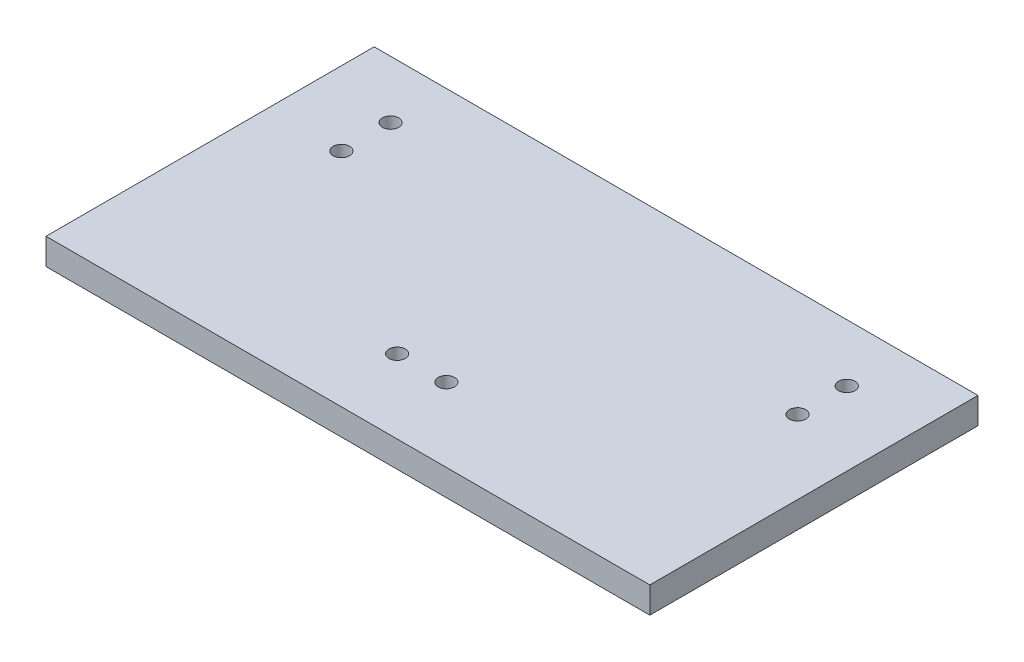
ISO-10303-21;
HEADER;
FILE_DESCRIPTION(('STEP AP214'),'2;1');
FILE_NAME('part.step','',(''),(''),'','','');
FILE_SCHEMA(('AUTOMOTIVE_DESIGN { 1 0 10303 214 1 1 1 1 }'));
ENDSEC;
DATA;
#1=APPLICATION_CONTEXT('core data for automotive mechanical design processes');
#2=APPLICATION_PROTOCOL_DEFINITION('international standard','automotive_design',2000,#1);
#3=PRODUCT_CONTEXT('',#1,'mechanical');
#4=PRODUCT('Part','Part','',(#3));
#5=PRODUCT_RELATED_PRODUCT_CATEGORY('part','',(#4));
#6=PRODUCT_DEFINITION_FORMATION('','',#4);
#7=PRODUCT_DEFINITION_CONTEXT('part definition',#1,'design');
#8=PRODUCT_DEFINITION('design','',#6,#7);
#9=PRODUCT_DEFINITION_SHAPE('','',#8);
#10=(LENGTH_UNIT() NAMED_UNIT(*) SI_UNIT(.MILLI.,.METRE.));
#11=(NAMED_UNIT(*) PLANE_ANGLE_UNIT() SI_UNIT($,.RADIAN.));
#12=(NAMED_UNIT(*) SI_UNIT($,.STERADIAN.) SOLID_ANGLE_UNIT());
#13=UNCERTAINTY_MEASURE_WITH_UNIT(LENGTH_MEASURE(1.E-05),#10,'distance_accuracy_value','');
#14=(GEOMETRIC_REPRESENTATION_CONTEXT(3) GLOBAL_UNCERTAINTY_ASSIGNED_CONTEXT((#13)) GLOBAL_UNIT_ASSIGNED_CONTEXT((#10,
#11,#12)) REPRESENTATION_CONTEXT('',''));
#15=CARTESIAN_POINT('',(0.,0.,0.));
#16=DIRECTION('',(0.,0.,1.));
#17=DIRECTION('',(1.,0.,0.));
#18=AXIS2_PLACEMENT_3D('',#15,#16,#17);
#19=CARTESIAN_POINT('',(-92.,8.,-50.));
#20=DIRECTION('',(1.,0.,0.));
#21=DIRECTION('',(0.,0.,-1.));
#22=AXIS2_PLACEMENT_3D('',#19,#20,#21);
#23=PLANE('',#22);
#24=DIRECTION('',(0.,0.,1.));
#25=VECTOR('',#24,1.);
#26=CARTESIAN_POINT('',(-92.,0.,-50.));
#27=LINE('',#26,#25);
#28=CARTESIAN_POINT('',(-92.,0.,-50.));
#29=VERTEX_POINT('',#28);
#30=CARTESIAN_POINT('',(-92.,0.,50.));
#31=VERTEX_POINT('',#30);
#32=EDGE_CURVE('E99',#29,#31,#27,.T.);
#33=ORIENTED_EDGE('',*,*,#32,.T.);
#34=DIRECTION('',(0.,-1.,0.));
#35=VECTOR('',#34,1.);
#36=CARTESIAN_POINT('',(-92.,8.,50.));
#37=LINE('',#36,#35);
#38=CARTESIAN_POINT('',(-92.,8.,50.));
#39=VERTEX_POINT('',#38);
#40=EDGE_CURVE('E11',#39,#31,#37,.T.);
#41=ORIENTED_EDGE('',*,*,#40,.F.);
#42=DIRECTION('',(0.,0.,1.));
#43=VECTOR('',#42,1.);
#44=CARTESIAN_POINT('',(-92.,8.,-50.));
#45=LINE('',#44,#43);
#46=CARTESIAN_POINT('',(-92.,8.,-50.));
#47=VERTEX_POINT('',#46);
#48=EDGE_CURVE('E87',#47,#39,#45,.T.);
#49=ORIENTED_EDGE('',*,*,#48,.F.);
#50=DIRECTION('',(0.,-1.,0.));
#51=VECTOR('',#50,1.);
#52=CARTESIAN_POINT('',(-92.,8.,-50.));
#53=LINE('',#52,#51);
#54=EDGE_CURVE('E95',#47,#29,#53,.T.);
#55=ORIENTED_EDGE('',*,*,#54,.T.);
#56=EDGE_LOOP('',(#33,#41,#49,#55));
#57=FACE_BOUND('',#56,.T.);
#58=ADVANCED_FACE('F36',(#57),#23,.F.);
#59=CARTESIAN_POINT('',(92.,8.,50.));
#60=DIRECTION('',(0.,0.,-1.));
#61=DIRECTION('',(-1.,0.,0.));
#62=AXIS2_PLACEMENT_3D('',#59,#60,#61);
#63=PLANE('',#62);
#64=DIRECTION('',(1.,0.,0.));
#65=VECTOR('',#64,1.);
#66=CARTESIAN_POINT('',(92.,0.,50.));
#67=LINE('',#66,#65);
#68=CARTESIAN_POINT('',(92.,0.,50.));
#69=VERTEX_POINT('',#68);
#70=EDGE_CURVE('E91',#31,#69,#67,.T.);
#71=ORIENTED_EDGE('',*,*,#70,.T.);
#72=DIRECTION('',(0.,-1.,0.));
#73=VECTOR('',#72,1.);
#74=CARTESIAN_POINT('',(92.,8.,50.));
#75=LINE('',#74,#73);
#76=CARTESIAN_POINT('',(92.,8.,50.));
#77=VERTEX_POINT('',#76);
#78=EDGE_CURVE('E44',#77,#69,#75,.T.);
#79=ORIENTED_EDGE('',*,*,#78,.F.);
#80=DIRECTION('',(1.,0.,0.));
#81=VECTOR('',#80,1.);
#82=CARTESIAN_POINT('',(92.,8.,50.));
#83=LINE('',#82,#81);
#84=EDGE_CURVE('E82',#39,#77,#83,.T.);
#85=ORIENTED_EDGE('',*,*,#84,.F.);
#86=ORIENTED_EDGE('',*,*,#40,.T.);
#87=EDGE_LOOP('',(#71,#79,#85,#86));
#88=FACE_BOUND('',#87,.T.);
#89=ADVANCED_FACE('F90',(#88),#63,.F.);
#90=CARTESIAN_POINT('',(92.,8.,-50.));
#91=DIRECTION('',(-1.,0.,0.));
#92=DIRECTION('',(0.,0.,1.));
#93=AXIS2_PLACEMENT_3D('',#90,#91,#92);
#94=PLANE('',#93);
#95=DIRECTION('',(0.,0.,-1.));
#96=VECTOR('',#95,1.);
#97=CARTESIAN_POINT('',(92.,0.,-50.));
#98=LINE('',#97,#96);
#99=CARTESIAN_POINT('',(92.,0.,-50.));
#100=VERTEX_POINT('',#99);
#101=EDGE_CURVE('E69',#69,#100,#98,.T.);
#102=ORIENTED_EDGE('',*,*,#101,.T.);
#103=DIRECTION('',(0.,-1.,0.));
#104=VECTOR('',#103,1.);
#105=CARTESIAN_POINT('',(92.,8.,-50.));
#106=LINE('',#105,#104);
#107=CARTESIAN_POINT('',(92.,8.,-50.));
#108=VERTEX_POINT('',#107);
#109=EDGE_CURVE('E92',#108,#100,#106,.T.);
#110=ORIENTED_EDGE('',*,*,#109,.F.);
#111=DIRECTION('',(0.,0.,-1.));
#112=VECTOR('',#111,1.);
#113=CARTESIAN_POINT('',(92.,8.,-50.));
#114=LINE('',#113,#112);
#115=EDGE_CURVE('E85',#77,#108,#114,.T.);
#116=ORIENTED_EDGE('',*,*,#115,.F.);
#117=ORIENTED_EDGE('',*,*,#78,.T.);
#118=EDGE_LOOP('',(#102,#110,#116,#117));
#119=FACE_BOUND('',#118,.T.);
#120=ADVANCED_FACE('F93',(#119),#94,.F.);
#121=CARTESIAN_POINT('',(92.,8.,-50.));
#122=DIRECTION('',(0.,0.,1.));
#123=DIRECTION('',(1.,0.,0.));
#124=AXIS2_PLACEMENT_3D('',#121,#122,#123);
#125=PLANE('',#124);
#126=DIRECTION('',(-1.,0.,0.));
#127=VECTOR('',#126,1.);
#128=CARTESIAN_POINT('',(92.,0.,-50.));
#129=LINE('',#128,#127);
#130=EDGE_CURVE('E75',#100,#29,#129,.T.);
#131=ORIENTED_EDGE('',*,*,#130,.T.);
#132=ORIENTED_EDGE('',*,*,#54,.F.);
#133=DIRECTION('',(-1.,0.,0.));
#134=VECTOR('',#133,1.);
#135=CARTESIAN_POINT('',(92.,8.,-50.));
#136=LINE('',#135,#134);
#137=EDGE_CURVE('E52',#108,#47,#136,.T.);
#138=ORIENTED_EDGE('',*,*,#137,.F.);
#139=ORIENTED_EDGE('',*,*,#109,.T.);
#140=EDGE_LOOP('',(#131,#132,#138,#139));
#141=FACE_BOUND('',#140,.T.);
#142=ADVANCED_FACE('F107',(#141),#125,.F.);
#143=CARTESIAN_POINT('',(0.,8.,0.));
#144=DIRECTION('',(0.,-1.,0.));
#145=DIRECTION('',(0.,0.,-1.));
#146=AXIS2_PLACEMENT_3D('',#143,#144,#145);
#147=PLANE('',#146);
#148=CARTESIAN_POINT('',(-69.5,7.99999999999999,-17.5));
#149=DIRECTION('',(0.,1.,0.));
#150=DIRECTION('',(0.,0.,-1.));
#151=AXIS2_PLACEMENT_3D('',#148,#149,#150);
#152=CIRCLE('',#151,2.50000000000001);
#153=CARTESIAN_POINT('',(-69.5,7.99999999999999,-20.));
#154=VERTEX_POINT('',#153);
#155=EDGE_CURVE('E140',#154,#154,#152,.T.);
#156=ORIENTED_EDGE('',*,*,#155,.F.);
#157=EDGE_LOOP('',(#156));
#158=FACE_BOUND('',#157,.T.);
#159=CARTESIAN_POINT('',(-69.5,7.99999999999999,-32.5));
#160=DIRECTION('',(0.,1.,0.));
#161=DIRECTION('',(0.,0.,-1.));
#162=AXIS2_PLACEMENT_3D('',#159,#160,#161);
#163=CIRCLE('',#162,2.50000000000001);
#164=CARTESIAN_POINT('',(-69.5,7.99999999999999,-35.));
#165=VERTEX_POINT('',#164);
#166=EDGE_CURVE('E134',#165,#165,#163,.T.);
#167=ORIENTED_EDGE('',*,*,#166,.F.);
#168=EDGE_LOOP('',(#167));
#169=FACE_BOUND('',#168,.T.);
#170=CARTESIAN_POINT('',(69.5,7.99999999999999,-17.5));
#171=DIRECTION('',(0.,-1.,0.));
#172=DIRECTION('',(0.,0.,-1.));
#173=AXIS2_PLACEMENT_3D('',#170,#171,#172);
#174=CIRCLE('',#173,2.50000000000001);
#175=CARTESIAN_POINT('',(69.5,7.99999999999999,-20.));
#176=VERTEX_POINT('',#175);
#177=EDGE_CURVE('E128',#176,#176,#174,.T.);
#178=ORIENTED_EDGE('',*,*,#177,.T.);
#179=EDGE_LOOP('',(#178));
#180=FACE_BOUND('',#179,.T.);
#181=CARTESIAN_POINT('',(69.5,7.99999999999999,-32.5));
#182=DIRECTION('',(0.,-1.,0.));
#183=DIRECTION('',(0.,0.,-1.));
#184=AXIS2_PLACEMENT_3D('',#181,#182,#183);
#185=CIRCLE('',#184,2.50000000000001);
#186=CARTESIAN_POINT('',(69.5,7.99999999999999,-35.));
#187=VERTEX_POINT('',#186);
#188=EDGE_CURVE('E122',#187,#187,#185,.T.);
#189=ORIENTED_EDGE('',*,*,#188,.T.);
#190=EDGE_LOOP('',(#189));
#191=FACE_BOUND('',#190,.T.);
#192=CARTESIAN_POINT('',(-7.49999999999758,7.99999999999999,27.5000000000019));
#193=DIRECTION('',(0.,-1.,0.));
#194=DIRECTION('',(0.,0.,-1.));
#195=AXIS2_PLACEMENT_3D('',#192,#193,#194);
#196=CIRCLE('',#195,2.5);
#197=CARTESIAN_POINT('',(-7.49999999999758,7.99999999999999,25.0000000000019));
#198=VERTEX_POINT('',#197);
#199=EDGE_CURVE('E116',#198,#198,#196,.T.);
#200=ORIENTED_EDGE('',*,*,#199,.T.);
#201=EDGE_LOOP('',(#200));
#202=FACE_BOUND('',#201,.T.);
#203=CARTESIAN_POINT('',(7.50000000000242,7.99999999999999,27.5000000000019));
#204=DIRECTION('',(0.,-1.,0.));
#205=DIRECTION('',(0.,0.,-1.));
#206=AXIS2_PLACEMENT_3D('',#203,#204,#205);
#207=CIRCLE('',#206,2.5);
#208=CARTESIAN_POINT('',(7.50000000000242,7.99999999999999,25.0000000000019));
#209=VERTEX_POINT('',#208);
#210=EDGE_CURVE('E102',#209,#209,#207,.T.);
#211=ORIENTED_EDGE('',*,*,#210,.T.);
#212=EDGE_LOOP('',(#211));
#213=FACE_BOUND('',#212,.T.);
#214=ORIENTED_EDGE('',*,*,#48,.T.);
#215=ORIENTED_EDGE('',*,*,#84,.T.);
#216=ORIENTED_EDGE('',*,*,#115,.T.);
#217=ORIENTED_EDGE('',*,*,#137,.T.);
#218=EDGE_LOOP('',(#214,#215,#216,#217));
#219=FACE_BOUND('',#218,.T.);
#220=ADVANCED_FACE('F83',(#158,#169,#180,#191,#202,#213,#219),#147,.F.);
#221=CARTESIAN_POINT('',(0.,0.,0.));
#222=DIRECTION('',(0.,-1.,0.));
#223=DIRECTION('',(0.,0.,-1.));
#224=AXIS2_PLACEMENT_3D('',#221,#222,#223);
#225=PLANE('',#224);
#226=CARTESIAN_POINT('',(-69.5,0.,-17.5));
#227=DIRECTION('',(0.,1.,0.));
#228=DIRECTION('',(0.,0.,-1.));
#229=AXIS2_PLACEMENT_3D('',#226,#227,#228);
#230=CIRCLE('',#229,2.50000000000001);
#231=CARTESIAN_POINT('',(-69.5,0.,-20.));
#232=VERTEX_POINT('',#231);
#233=EDGE_CURVE('E143',#232,#232,#230,.T.);
#234=ORIENTED_EDGE('',*,*,#233,.T.);
#235=EDGE_LOOP('',(#234));
#236=FACE_BOUND('',#235,.T.);
#237=CARTESIAN_POINT('',(-69.5,0.,-32.5));
#238=DIRECTION('',(0.,1.,0.));
#239=DIRECTION('',(0.,0.,-1.));
#240=AXIS2_PLACEMENT_3D('',#237,#238,#239);
#241=CIRCLE('',#240,2.50000000000001);
#242=CARTESIAN_POINT('',(-69.5,0.,-35.));
#243=VERTEX_POINT('',#242);
#244=EDGE_CURVE('E137',#243,#243,#241,.T.);
#245=ORIENTED_EDGE('',*,*,#244,.T.);
#246=EDGE_LOOP('',(#245));
#247=FACE_BOUND('',#246,.T.);
#248=CARTESIAN_POINT('',(69.5,0.,-17.5));
#249=DIRECTION('',(0.,-1.,0.));
#250=DIRECTION('',(0.,0.,-1.));
#251=AXIS2_PLACEMENT_3D('',#248,#249,#250);
#252=CIRCLE('',#251,2.50000000000001);
#253=CARTESIAN_POINT('',(69.5,0.,-20.));
#254=VERTEX_POINT('',#253);
#255=EDGE_CURVE('E131',#254,#254,#252,.T.);
#256=ORIENTED_EDGE('',*,*,#255,.F.);
#257=EDGE_LOOP('',(#256));
#258=FACE_BOUND('',#257,.T.);
#259=CARTESIAN_POINT('',(69.5,0.,-32.5));
#260=DIRECTION('',(0.,-1.,0.));
#261=DIRECTION('',(0.,0.,-1.));
#262=AXIS2_PLACEMENT_3D('',#259,#260,#261);
#263=CIRCLE('',#262,2.50000000000001);
#264=CARTESIAN_POINT('',(69.5,0.,-35.));
#265=VERTEX_POINT('',#264);
#266=EDGE_CURVE('E125',#265,#265,#263,.T.);
#267=ORIENTED_EDGE('',*,*,#266,.F.);
#268=EDGE_LOOP('',(#267));
#269=FACE_BOUND('',#268,.T.);
#270=CARTESIAN_POINT('',(-7.49999999999758,0.,27.5000000000019));
#271=DIRECTION('',(0.,-1.,0.));
#272=DIRECTION('',(0.,0.,-1.));
#273=AXIS2_PLACEMENT_3D('',#270,#271,#272);
#274=CIRCLE('',#273,2.5);
#275=CARTESIAN_POINT('',(-7.49999999999758,0.,25.0000000000019));
#276=VERTEX_POINT('',#275);
#277=EDGE_CURVE('E119',#276,#276,#274,.T.);
#278=ORIENTED_EDGE('',*,*,#277,.F.);
#279=EDGE_LOOP('',(#278));
#280=FACE_BOUND('',#279,.T.);
#281=CARTESIAN_POINT('',(7.50000000000242,0.,27.5000000000019));
#282=DIRECTION('',(0.,-1.,0.));
#283=DIRECTION('',(0.,0.,-1.));
#284=AXIS2_PLACEMENT_3D('',#281,#282,#283);
#285=CIRCLE('',#284,2.5);
#286=CARTESIAN_POINT('',(7.50000000000242,0.,25.0000000000019));
#287=VERTEX_POINT('',#286);
#288=EDGE_CURVE('E113',#287,#287,#285,.T.);
#289=ORIENTED_EDGE('',*,*,#288,.F.);
#290=EDGE_LOOP('',(#289));
#291=FACE_BOUND('',#290,.T.);
#292=ORIENTED_EDGE('',*,*,#32,.F.);
#293=ORIENTED_EDGE('',*,*,#130,.F.);
#294=ORIENTED_EDGE('',*,*,#101,.F.);
#295=ORIENTED_EDGE('',*,*,#70,.F.);
#296=EDGE_LOOP('',(#292,#293,#294,#295));
#297=FACE_BOUND('',#296,.T.);
#298=ADVANCED_FACE('F110',(#236,#247,#258,#269,#280,#291,#297),#225,.T.);
#299=CARTESIAN_POINT('',(7.50000000000242,7.99999999999999,27.5000000000019));
#300=DIRECTION('',(0.,-1.,0.));
#301=DIRECTION('',(0.,0.,-1.));
#302=AXIS2_PLACEMENT_3D('',#299,#300,#301);
#303=CYLINDRICAL_SURFACE('',#302,2.5);
#304=ORIENTED_EDGE('',*,*,#210,.F.);
#305=EDGE_LOOP('',(#304));
#306=FACE_BOUND('',#305,.T.);
#307=ORIENTED_EDGE('',*,*,#288,.T.);
#308=EDGE_LOOP('',(#307));
#309=FACE_BOUND('',#308,.T.);
#310=ADVANCED_FACE('F165',(#306,#309),#303,.F.);
#311=CARTESIAN_POINT('',(-7.49999999999758,7.99999999999999,27.5000000000019));
#312=DIRECTION('',(0.,-1.,0.));
#313=DIRECTION('',(0.,0.,-1.));
#314=AXIS2_PLACEMENT_3D('',#311,#312,#313);
#315=CYLINDRICAL_SURFACE('',#314,2.5);
#316=ORIENTED_EDGE('',*,*,#199,.F.);
#317=EDGE_LOOP('',(#316));
#318=FACE_BOUND('',#317,.T.);
#319=ORIENTED_EDGE('',*,*,#277,.T.);
#320=EDGE_LOOP('',(#319));
#321=FACE_BOUND('',#320,.T.);
#322=ADVANCED_FACE('F168',(#318,#321),#315,.F.);
#323=CARTESIAN_POINT('',(69.5,7.99999999999999,-32.5));
#324=DIRECTION('',(0.,-1.,0.));
#325=DIRECTION('',(0.,0.,-1.));
#326=AXIS2_PLACEMENT_3D('',#323,#324,#325);
#327=CYLINDRICAL_SURFACE('',#326,2.50000000000001);
#328=ORIENTED_EDGE('',*,*,#188,.F.);
#329=EDGE_LOOP('',(#328));
#330=FACE_BOUND('',#329,.T.);
#331=ORIENTED_EDGE('',*,*,#266,.T.);
#332=EDGE_LOOP('',(#331));
#333=FACE_BOUND('',#332,.T.);
#334=ADVANCED_FACE('F214',(#330,#333),#327,.F.);
#335=CARTESIAN_POINT('',(69.5,7.99999999999999,-17.5));
#336=DIRECTION('',(0.,-1.,0.));
#337=DIRECTION('',(0.,0.,-1.));
#338=AXIS2_PLACEMENT_3D('',#335,#336,#337);
#339=CYLINDRICAL_SURFACE('',#338,2.50000000000001);
#340=ORIENTED_EDGE('',*,*,#177,.F.);
#341=EDGE_LOOP('',(#340));
#342=FACE_BOUND('',#341,.T.);
#343=ORIENTED_EDGE('',*,*,#255,.T.);
#344=EDGE_LOOP('',(#343));
#345=FACE_BOUND('',#344,.T.);
#346=ADVANCED_FACE('F222',(#342,#345),#339,.F.);
#347=CARTESIAN_POINT('',(-69.5,7.99999999999999,-32.5));
#348=DIRECTION('',(0.,-1.,0.));
#349=DIRECTION('',(0.,0.,-1.));
#350=AXIS2_PLACEMENT_3D('',#347,#348,#349);
#351=CYLINDRICAL_SURFACE('',#350,2.50000000000001);
#352=ORIENTED_EDGE('',*,*,#166,.T.);
#353=EDGE_LOOP('',(#352));
#354=FACE_BOUND('',#353,.T.);
#355=ORIENTED_EDGE('',*,*,#244,.F.);
#356=EDGE_LOOP('',(#355));
#357=FACE_BOUND('',#356,.T.);
#358=ADVANCED_FACE('F229',(#354,#357),#351,.F.);
#359=CARTESIAN_POINT('',(-69.5,7.99999999999999,-17.5));
#360=DIRECTION('',(0.,-1.,0.));
#361=DIRECTION('',(0.,0.,-1.));
#362=AXIS2_PLACEMENT_3D('',#359,#360,#361);
#363=CYLINDRICAL_SURFACE('',#362,2.50000000000001);
#364=ORIENTED_EDGE('',*,*,#155,.T.);
#365=EDGE_LOOP('',(#364));
#366=FACE_BOUND('',#365,.T.);
#367=ORIENTED_EDGE('',*,*,#233,.F.);
#368=EDGE_LOOP('',(#367));
#369=FACE_BOUND('',#368,.T.);
#370=ADVANCED_FACE('F149',(#366,#369),#363,.F.);
#371=CLOSED_SHELL('',(#58,#89,#120,#142,#220,#298,#310,#322,#334,#346,#358,#370));
#372=MANIFOLD_SOLID_BREP('B2',#371);
#373=ADVANCED_BREP_SHAPE_REPRESENTATION('',(#18,#372),#14);
#374=SHAPE_DEFINITION_REPRESENTATION(#9,#373);
ENDSEC;
END-ISO-10303-21;
